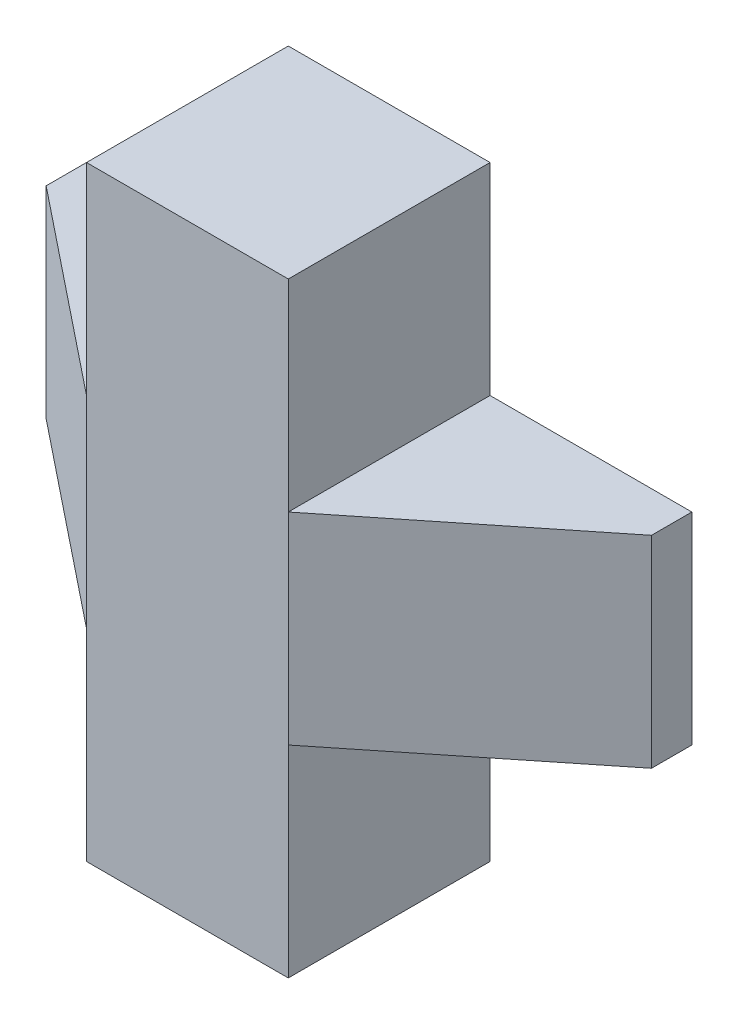
ISO-10303-21;
HEADER;
FILE_DESCRIPTION(('STEP AP214'),'2;1');
FILE_NAME('part.step','',(''),(''),'','','');
FILE_SCHEMA(('AUTOMOTIVE_DESIGN { 1 0 10303 214 1 1 1 1 }'));
ENDSEC;
DATA;
#1=APPLICATION_CONTEXT('core data for automotive mechanical design processes');
#2=APPLICATION_PROTOCOL_DEFINITION('international standard','automotive_design',2000,#1);
#3=PRODUCT_CONTEXT('',#1,'mechanical');
#4=PRODUCT('Part','Part','',(#3));
#5=PRODUCT_RELATED_PRODUCT_CATEGORY('part','',(#4));
#6=PRODUCT_DEFINITION_FORMATION('','',#4);
#7=PRODUCT_DEFINITION_CONTEXT('part definition',#1,'design');
#8=PRODUCT_DEFINITION('design','',#6,#7);
#9=PRODUCT_DEFINITION_SHAPE('','',#8);
#10=(LENGTH_UNIT() NAMED_UNIT(*) SI_UNIT(.MILLI.,.METRE.));
#11=(NAMED_UNIT(*) PLANE_ANGLE_UNIT() SI_UNIT($,.RADIAN.));
#12=(NAMED_UNIT(*) SI_UNIT($,.STERADIAN.) SOLID_ANGLE_UNIT());
#13=UNCERTAINTY_MEASURE_WITH_UNIT(LENGTH_MEASURE(1.E-05),#10,'distance_accuracy_value','');
#14=(GEOMETRIC_REPRESENTATION_CONTEXT(3) GLOBAL_UNCERTAINTY_ASSIGNED_CONTEXT((#13)) GLOBAL_UNIT_ASSIGNED_CONTEXT((#10,
#11,#12)) REPRESENTATION_CONTEXT('',''));
#15=CARTESIAN_POINT('',(0.,0.,0.));
#16=DIRECTION('',(0.,0.,1.));
#17=DIRECTION('',(1.,0.,0.));
#18=AXIS2_PLACEMENT_3D('',#15,#16,#17);
#19=CARTESIAN_POINT('',(-75.,-75.,50.));
#20=DIRECTION('',(1.,0.,0.));
#21=DIRECTION('',(0.,0.,-1.));
#22=AXIS2_PLACEMENT_3D('',#19,#20,#21);
#23=PLANE('',#22);
#24=DIRECTION('',(0.,0.,1.));
#25=VECTOR('',#24,1.);
#26=CARTESIAN_POINT('',(-75.,-25.,0.));
#27=LINE('',#26,#25);
#28=CARTESIAN_POINT('',(-75.,-25.,0.));
#29=VERTEX_POINT('',#28);
#30=CARTESIAN_POINT('',(-75.,-25.,10.));
#31=VERTEX_POINT('',#30);
#32=EDGE_CURVE('E192',#29,#31,#27,.T.);
#33=ORIENTED_EDGE('',*,*,#32,.T.);
#34=DIRECTION('',(0.,1.,0.));
#35=VECTOR('',#34,1.);
#36=CARTESIAN_POINT('',(-75.,-25.,10.));
#37=LINE('',#36,#35);
#38=CARTESIAN_POINT('',(-75.,25.,10.));
#39=VERTEX_POINT('',#38);
#40=EDGE_CURVE('E62',#31,#39,#37,.T.);
#41=ORIENTED_EDGE('',*,*,#40,.T.);
#42=DIRECTION('',(0.,0.,1.));
#43=VECTOR('',#42,1.);
#44=CARTESIAN_POINT('',(-75.,25.,0.));
#45=LINE('',#44,#43);
#46=CARTESIAN_POINT('',(-75.,25.,0.));
#47=VERTEX_POINT('',#46);
#48=EDGE_CURVE('E214',#47,#39,#45,.T.);
#49=ORIENTED_EDGE('',*,*,#48,.F.);
#50=DIRECTION('',(0.,-1.,0.));
#51=VECTOR('',#50,1.);
#52=CARTESIAN_POINT('',(-75.,-75.,0.));
#53=LINE('',#52,#51);
#54=EDGE_CURVE('E222',#47,#29,#53,.T.);
#55=ORIENTED_EDGE('',*,*,#54,.T.);
#56=EDGE_LOOP('',(#33,#41,#49,#55));
#57=FACE_BOUND('',#56,.T.);
#58=ADVANCED_FACE('F45',(#57),#23,.F.);
#59=CARTESIAN_POINT('',(75.,-75.,50.));
#60=DIRECTION('',(0.,1.,0.));
#61=DIRECTION('',(-1.,0.,0.));
#62=AXIS2_PLACEMENT_3D('',#59,#60,#61);
#63=PLANE('',#62);
#64=DIRECTION('',(1.,0.,0.));
#65=VECTOR('',#64,1.);
#66=CARTESIAN_POINT('',(75.,-75.,50.));
#67=LINE('',#66,#65);
#68=CARTESIAN_POINT('',(-25.,-75.,50.));
#69=VERTEX_POINT('',#68);
#70=CARTESIAN_POINT('',(25.,-75.,50.));
#71=VERTEX_POINT('',#70);
#72=EDGE_CURVE('E54',#69,#71,#67,.T.);
#73=ORIENTED_EDGE('',*,*,#72,.F.);
#74=DIRECTION('',(0.,0.,1.));
#75=VECTOR('',#74,1.);
#76=CARTESIAN_POINT('',(-25.,-75.,0.));
#77=LINE('',#76,#75);
#78=CARTESIAN_POINT('',(-25.,-75.,0.));
#79=VERTEX_POINT('',#78);
#80=EDGE_CURVE('E186',#79,#69,#77,.T.);
#81=ORIENTED_EDGE('',*,*,#80,.F.);
#82=DIRECTION('',(1.,0.,0.));
#83=VECTOR('',#82,1.);
#84=CARTESIAN_POINT('',(75.,-75.,0.));
#85=LINE('',#84,#83);
#86=CARTESIAN_POINT('',(25.,-75.,0.));
#87=VERTEX_POINT('',#86);
#88=EDGE_CURVE('E236',#79,#87,#85,.T.);
#89=ORIENTED_EDGE('',*,*,#88,.T.);
#90=DIRECTION('',(0.,0.,1.));
#91=VECTOR('',#90,1.);
#92=CARTESIAN_POINT('',(25.,-75.,0.));
#93=LINE('',#92,#91);
#94=EDGE_CURVE('E171',#87,#71,#93,.T.);
#95=ORIENTED_EDGE('',*,*,#94,.T.);
#96=EDGE_LOOP('',(#73,#81,#89,#95));
#97=FACE_BOUND('',#96,.T.);
#98=ADVANCED_FACE('F311',(#97),#63,.F.);
#99=CARTESIAN_POINT('',(75.,-75.,50.));
#100=DIRECTION('',(-1.,0.,0.));
#101=DIRECTION('',(0.,0.,1.));
#102=AXIS2_PLACEMENT_3D('',#99,#100,#101);
#103=PLANE('',#102);
#104=DIRECTION('',(0.,0.,1.));
#105=VECTOR('',#104,1.);
#106=CARTESIAN_POINT('',(75.,25.,0.));
#107=LINE('',#106,#105);
#108=CARTESIAN_POINT('',(75.,25.,0.));
#109=VERTEX_POINT('',#108);
#110=CARTESIAN_POINT('',(75.,25.,10.));
#111=VERTEX_POINT('',#110);
#112=EDGE_CURVE('E157',#109,#111,#107,.T.);
#113=ORIENTED_EDGE('',*,*,#112,.T.);
#114=DIRECTION('',(0.,1.,0.));
#115=VECTOR('',#114,1.);
#116=CARTESIAN_POINT('',(75.,-25.,10.));
#117=LINE('',#116,#115);
#118=CARTESIAN_POINT('',(75.,-25.,10.));
#119=VERTEX_POINT('',#118);
#120=EDGE_CURVE('E139',#119,#111,#117,.T.);
#121=ORIENTED_EDGE('',*,*,#120,.F.);
#122=DIRECTION('',(0.,0.,1.));
#123=VECTOR('',#122,1.);
#124=CARTESIAN_POINT('',(75.,-25.,0.));
#125=LINE('',#124,#123);
#126=CARTESIAN_POINT('',(75.,-25.,0.));
#127=VERTEX_POINT('',#126);
#128=EDGE_CURVE('E155',#127,#119,#125,.T.);
#129=ORIENTED_EDGE('',*,*,#128,.F.);
#130=DIRECTION('',(0.,1.,0.));
#131=VECTOR('',#130,1.);
#132=CARTESIAN_POINT('',(75.,-75.,0.));
#133=LINE('',#132,#131);
#134=EDGE_CURVE('E239',#127,#109,#133,.T.);
#135=ORIENTED_EDGE('',*,*,#134,.T.);
#136=EDGE_LOOP('',(#113,#121,#129,#135));
#137=FACE_BOUND('',#136,.T.);
#138=ADVANCED_FACE('F153',(#137),#103,.F.);
#139=CARTESIAN_POINT('',(75.,75.,50.));
#140=DIRECTION('',(0.,-1.,0.));
#141=DIRECTION('',(1.,0.,0.));
#142=AXIS2_PLACEMENT_3D('',#139,#140,#141);
#143=PLANE('',#142);
#144=DIRECTION('',(-1.,0.,0.));
#145=VECTOR('',#144,1.);
#146=CARTESIAN_POINT('',(75.,75.,50.));
#147=LINE('',#146,#145);
#148=CARTESIAN_POINT('',(25.,75.,50.));
#149=VERTEX_POINT('',#148);
#150=CARTESIAN_POINT('',(-25.,75.,50.));
#151=VERTEX_POINT('',#150);
#152=EDGE_CURVE('E11',#149,#151,#147,.T.);
#153=ORIENTED_EDGE('',*,*,#152,.F.);
#154=DIRECTION('',(0.,0.,1.));
#155=VECTOR('',#154,1.);
#156=CARTESIAN_POINT('',(25.,75.,0.));
#157=LINE('',#156,#155);
#158=CARTESIAN_POINT('',(25.,75.,0.));
#159=VERTEX_POINT('',#158);
#160=EDGE_CURVE('E248',#159,#149,#157,.T.);
#161=ORIENTED_EDGE('',*,*,#160,.F.);
#162=DIRECTION('',(-1.,0.,0.));
#163=VECTOR('',#162,1.);
#164=CARTESIAN_POINT('',(75.,75.,0.));
#165=LINE('',#164,#163);
#166=CARTESIAN_POINT('',(-25.,75.,0.));
#167=VERTEX_POINT('',#166);
#168=EDGE_CURVE('E48',#159,#167,#165,.T.);
#169=ORIENTED_EDGE('',*,*,#168,.T.);
#170=DIRECTION('',(0.,0.,1.));
#171=VECTOR('',#170,1.);
#172=CARTESIAN_POINT('',(-25.,75.,0.));
#173=LINE('',#172,#171);
#174=EDGE_CURVE('E218',#167,#151,#173,.T.);
#175=ORIENTED_EDGE('',*,*,#174,.T.);
#176=EDGE_LOOP('',(#153,#161,#169,#175));
#177=FACE_BOUND('',#176,.T.);
#178=ADVANCED_FACE('F247',(#177),#143,.F.);
#179=CARTESIAN_POINT('',(0.,0.,50.));
#180=DIRECTION('',(0.,0.,1.));
#181=DIRECTION('',(1.,0.,0.));
#182=AXIS2_PLACEMENT_3D('',#179,#180,#181);
#183=PLANE('',#182);
#184=DIRECTION('',(0.,1.,0.));
#185=VECTOR('',#184,1.);
#186=CARTESIAN_POINT('',(25.,-25.,50.));
#187=LINE('',#186,#185);
#188=CARTESIAN_POINT('',(25.,-25.,50.));
#189=VERTEX_POINT('',#188);
#190=CARTESIAN_POINT('',(25.,25.,50.));
#191=VERTEX_POINT('',#190);
#192=EDGE_CURVE('E142',#189,#191,#187,.T.);
#193=ORIENTED_EDGE('',*,*,#192,.T.);
#194=DIRECTION('',(0.,-1.,0.));
#195=VECTOR('',#194,1.);
#196=CARTESIAN_POINT('',(25.,75.,50.));
#197=LINE('',#196,#195);
#198=EDGE_CURVE('E217',#149,#191,#197,.T.);
#199=ORIENTED_EDGE('',*,*,#198,.F.);
#200=ORIENTED_EDGE('',*,*,#152,.T.);
#201=DIRECTION('',(0.,1.,0.));
#202=VECTOR('',#201,1.);
#203=CARTESIAN_POINT('',(-25.,75.,50.));
#204=LINE('',#203,#202);
#205=CARTESIAN_POINT('',(-25.,25.,50.));
#206=VERTEX_POINT('',#205);
#207=EDGE_CURVE('E210',#206,#151,#204,.T.);
#208=ORIENTED_EDGE('',*,*,#207,.F.);
#209=DIRECTION('',(0.,1.,0.));
#210=VECTOR('',#209,1.);
#211=CARTESIAN_POINT('',(-25.,-25.,50.));
#212=LINE('',#211,#210);
#213=CARTESIAN_POINT('',(-25.,-25.,50.));
#214=VERTEX_POINT('',#213);
#215=EDGE_CURVE('E271',#214,#206,#212,.T.);
#216=ORIENTED_EDGE('',*,*,#215,.F.);
#217=DIRECTION('',(0.,1.,0.));
#218=VECTOR('',#217,1.);
#219=CARTESIAN_POINT('',(-25.,-75.,50.));
#220=LINE('',#219,#218);
#221=EDGE_CURVE('E180',#69,#214,#220,.T.);
#222=ORIENTED_EDGE('',*,*,#221,.F.);
#223=ORIENTED_EDGE('',*,*,#72,.T.);
#224=DIRECTION('',(0.,-1.,0.));
#225=VECTOR('',#224,1.);
#226=CARTESIAN_POINT('',(25.,-75.,50.));
#227=LINE('',#226,#225);
#228=EDGE_CURVE('E181',#189,#71,#227,.T.);
#229=ORIENTED_EDGE('',*,*,#228,.F.);
#230=EDGE_LOOP('',(#193,#199,#200,#208,#216,#222,#223,#229));
#231=FACE_BOUND('',#230,.T.);
#232=ADVANCED_FACE('F294',(#231),#183,.T.);
#233=CARTESIAN_POINT('',(0.,0.,0.));
#234=DIRECTION('',(0.,0.,1.));
#235=DIRECTION('',(1.,0.,0.));
#236=AXIS2_PLACEMENT_3D('',#233,#234,#235);
#237=PLANE('',#236);
#238=DIRECTION('',(0.,1.,0.));
#239=VECTOR('',#238,1.);
#240=CARTESIAN_POINT('',(-25.,-75.,0.));
#241=LINE('',#240,#239);
#242=CARTESIAN_POINT('',(-25.,-25.,0.));
#243=VERTEX_POINT('',#242);
#244=EDGE_CURVE('E199',#79,#243,#241,.T.);
#245=ORIENTED_EDGE('',*,*,#244,.T.);
#246=DIRECTION('',(-1.,0.,0.));
#247=VECTOR('',#246,1.);
#248=CARTESIAN_POINT('',(-75.,-25.,0.));
#249=LINE('',#248,#247);
#250=EDGE_CURVE('E70',#243,#29,#249,.T.);
#251=ORIENTED_EDGE('',*,*,#250,.T.);
#252=ORIENTED_EDGE('',*,*,#54,.F.);
#253=DIRECTION('',(1.,0.,0.));
#254=VECTOR('',#253,1.);
#255=CARTESIAN_POINT('',(-75.,25.,0.));
#256=LINE('',#255,#254);
#257=CARTESIAN_POINT('',(-25.,25.,0.));
#258=VERTEX_POINT('',#257);
#259=EDGE_CURVE('E205',#47,#258,#256,.T.);
#260=ORIENTED_EDGE('',*,*,#259,.T.);
#261=DIRECTION('',(0.,1.,0.));
#262=VECTOR('',#261,1.);
#263=CARTESIAN_POINT('',(-25.,75.,0.));
#264=LINE('',#263,#262);
#265=EDGE_CURVE('E209',#258,#167,#264,.T.);
#266=ORIENTED_EDGE('',*,*,#265,.T.);
#267=ORIENTED_EDGE('',*,*,#168,.F.);
#268=DIRECTION('',(0.,-1.,0.));
#269=VECTOR('',#268,1.);
#270=CARTESIAN_POINT('',(25.,75.,0.));
#271=LINE('',#270,#269);
#272=CARTESIAN_POINT('',(25.,25.,0.));
#273=VERTEX_POINT('',#272);
#274=EDGE_CURVE('E174',#159,#273,#271,.T.);
#275=ORIENTED_EDGE('',*,*,#274,.T.);
#276=DIRECTION('',(1.,0.,0.));
#277=VECTOR('',#276,1.);
#278=CARTESIAN_POINT('',(75.,25.,0.));
#279=LINE('',#278,#277);
#280=EDGE_CURVE('E276',#273,#109,#279,.T.);
#281=ORIENTED_EDGE('',*,*,#280,.T.);
#282=ORIENTED_EDGE('',*,*,#134,.F.);
#283=DIRECTION('',(-1.,0.,0.));
#284=VECTOR('',#283,1.);
#285=CARTESIAN_POINT('',(75.,-25.,0.));
#286=LINE('',#285,#284);
#287=CARTESIAN_POINT('',(25.,-25.,0.));
#288=VERTEX_POINT('',#287);
#289=EDGE_CURVE('E162',#127,#288,#286,.T.);
#290=ORIENTED_EDGE('',*,*,#289,.T.);
#291=DIRECTION('',(0.,-1.,0.));
#292=VECTOR('',#291,1.);
#293=CARTESIAN_POINT('',(25.,-75.,0.));
#294=LINE('',#293,#292);
#295=EDGE_CURVE('E164',#288,#87,#294,.T.);
#296=ORIENTED_EDGE('',*,*,#295,.T.);
#297=ORIENTED_EDGE('',*,*,#88,.F.);
#298=EDGE_LOOP('',(#245,#251,#252,#260,#266,#267,#275,#281,#282,#290,#296,#297));
#299=FACE_BOUND('',#298,.T.);
#300=ADVANCED_FACE('F251',(#299),#237,.F.);
#301=CARTESIAN_POINT('',(-25.,75.,0.));
#302=DIRECTION('',(1.,0.,0.));
#303=DIRECTION('',(0.,1.,0.));
#304=AXIS2_PLACEMENT_3D('',#301,#302,#303);
#305=PLANE('',#304);
#306=ORIENTED_EDGE('',*,*,#207,.T.);
#307=ORIENTED_EDGE('',*,*,#174,.F.);
#308=ORIENTED_EDGE('',*,*,#265,.F.);
#309=DIRECTION('',(0.,0.,1.));
#310=VECTOR('',#309,1.);
#311=CARTESIAN_POINT('',(-25.,25.,0.));
#312=LINE('',#311,#310);
#313=EDGE_CURVE('E223',#258,#206,#312,.T.);
#314=ORIENTED_EDGE('',*,*,#313,.T.);
#315=EDGE_LOOP('',(#306,#307,#308,#314));
#316=FACE_BOUND('',#315,.T.);
#317=ADVANCED_FACE('F256',(#316),#305,.F.);
#318=CARTESIAN_POINT('',(-75.,25.,0.));
#319=DIRECTION('',(0.,-1.,0.));
#320=DIRECTION('',(0.,0.,-1.));
#321=AXIS2_PLACEMENT_3D('',#318,#319,#320);
#322=PLANE('',#321);
#323=ORIENTED_EDGE('',*,*,#48,.T.);
#324=DIRECTION('',(-0.78086880944303,0.,-0.624695047554424));
#325=VECTOR('',#324,1.);
#326=CARTESIAN_POINT('',(-25.,25.,50.));
#327=LINE('',#326,#325);
#328=EDGE_CURVE('E262',#206,#39,#327,.T.);
#329=ORIENTED_EDGE('',*,*,#328,.F.);
#330=ORIENTED_EDGE('',*,*,#313,.F.);
#331=ORIENTED_EDGE('',*,*,#259,.F.);
#332=EDGE_LOOP('',(#323,#329,#330,#331));
#333=FACE_BOUND('',#332,.T.);
#334=ADVANCED_FACE('F260',(#333),#322,.F.);
#335=CARTESIAN_POINT('',(75.,25.,0.));
#336=DIRECTION('',(0.,-1.,0.));
#337=DIRECTION('',(0.,0.,-1.));
#338=AXIS2_PLACEMENT_3D('',#335,#336,#337);
#339=PLANE('',#338);
#340=DIRECTION('',(0.,0.,1.));
#341=VECTOR('',#340,1.);
#342=CARTESIAN_POINT('',(25.,25.,0.));
#343=LINE('',#342,#341);
#344=EDGE_CURVE('E277',#273,#191,#343,.T.);
#345=ORIENTED_EDGE('',*,*,#344,.T.);
#346=DIRECTION('',(-0.78086880944303,0.,0.624695047554424));
#347=VECTOR('',#346,1.);
#348=CARTESIAN_POINT('',(25.,25.,50.));
#349=LINE('',#348,#347);
#350=EDGE_CURVE('E148',#111,#191,#349,.T.);
#351=ORIENTED_EDGE('',*,*,#350,.F.);
#352=ORIENTED_EDGE('',*,*,#112,.F.);
#353=ORIENTED_EDGE('',*,*,#280,.F.);
#354=EDGE_LOOP('',(#345,#351,#352,#353));
#355=FACE_BOUND('',#354,.T.);
#356=ADVANCED_FACE('F289',(#355),#339,.F.);
#357=CARTESIAN_POINT('',(25.,75.,0.));
#358=DIRECTION('',(-1.,0.,0.));
#359=DIRECTION('',(0.,-1.,0.));
#360=AXIS2_PLACEMENT_3D('',#357,#358,#359);
#361=PLANE('',#360);
#362=ORIENTED_EDGE('',*,*,#198,.T.);
#363=ORIENTED_EDGE('',*,*,#344,.F.);
#364=ORIENTED_EDGE('',*,*,#274,.F.);
#365=ORIENTED_EDGE('',*,*,#160,.T.);
#366=EDGE_LOOP('',(#362,#363,#364,#365));
#367=FACE_BOUND('',#366,.T.);
#368=ADVANCED_FACE('F291',(#367),#361,.F.);
#369=CARTESIAN_POINT('',(25.,-75.,0.));
#370=DIRECTION('',(-1.,0.,0.));
#371=DIRECTION('',(0.,0.,1.));
#372=AXIS2_PLACEMENT_3D('',#369,#370,#371);
#373=PLANE('',#372);
#374=ORIENTED_EDGE('',*,*,#228,.T.);
#375=ORIENTED_EDGE('',*,*,#94,.F.);
#376=ORIENTED_EDGE('',*,*,#295,.F.);
#377=DIRECTION('',(0.,0.,1.));
#378=VECTOR('',#377,1.);
#379=CARTESIAN_POINT('',(25.,-25.,0.));
#380=LINE('',#379,#378);
#381=EDGE_CURVE('E165',#288,#189,#380,.T.);
#382=ORIENTED_EDGE('',*,*,#381,.T.);
#383=EDGE_LOOP('',(#374,#375,#376,#382));
#384=FACE_BOUND('',#383,.T.);
#385=ADVANCED_FACE('F313',(#384),#373,.F.);
#386=CARTESIAN_POINT('',(75.,-25.,0.));
#387=DIRECTION('',(0.,1.,0.));
#388=DIRECTION('',(-1.,0.,0.));
#389=AXIS2_PLACEMENT_3D('',#386,#387,#388);
#390=PLANE('',#389);
#391=ORIENTED_EDGE('',*,*,#128,.T.);
#392=DIRECTION('',(-0.78086880944303,0.,0.624695047554424));
#393=VECTOR('',#392,1.);
#394=CARTESIAN_POINT('',(25.,-25.,50.));
#395=LINE('',#394,#393);
#396=EDGE_CURVE('E136',#119,#189,#395,.T.);
#397=ORIENTED_EDGE('',*,*,#396,.T.);
#398=ORIENTED_EDGE('',*,*,#381,.F.);
#399=ORIENTED_EDGE('',*,*,#289,.F.);
#400=EDGE_LOOP('',(#391,#397,#398,#399));
#401=FACE_BOUND('',#400,.T.);
#402=ADVANCED_FACE('F160',(#401),#390,.F.);
#403=CARTESIAN_POINT('',(-75.,-25.,0.));
#404=DIRECTION('',(0.,1.,0.));
#405=DIRECTION('',(0.,0.,1.));
#406=AXIS2_PLACEMENT_3D('',#403,#404,#405);
#407=PLANE('',#406);
#408=DIRECTION('',(0.,0.,1.));
#409=VECTOR('',#408,1.);
#410=CARTESIAN_POINT('',(-25.,-25.,0.));
#411=LINE('',#410,#409);
#412=EDGE_CURVE('E189',#243,#214,#411,.T.);
#413=ORIENTED_EDGE('',*,*,#412,.T.);
#414=DIRECTION('',(-0.78086880944303,0.,-0.624695047554424));
#415=VECTOR('',#414,1.);
#416=CARTESIAN_POINT('',(-25.,-25.,50.));
#417=LINE('',#416,#415);
#418=EDGE_CURVE('E264',#214,#31,#417,.T.);
#419=ORIENTED_EDGE('',*,*,#418,.T.);
#420=ORIENTED_EDGE('',*,*,#32,.F.);
#421=ORIENTED_EDGE('',*,*,#250,.F.);
#422=EDGE_LOOP('',(#413,#419,#420,#421));
#423=FACE_BOUND('',#422,.T.);
#424=ADVANCED_FACE('F305',(#423),#407,.F.);
#425=CARTESIAN_POINT('',(-25.,-75.,0.));
#426=DIRECTION('',(1.,0.,0.));
#427=DIRECTION('',(0.,0.,-1.));
#428=AXIS2_PLACEMENT_3D('',#425,#426,#427);
#429=PLANE('',#428);
#430=ORIENTED_EDGE('',*,*,#221,.T.);
#431=ORIENTED_EDGE('',*,*,#412,.F.);
#432=ORIENTED_EDGE('',*,*,#244,.F.);
#433=ORIENTED_EDGE('',*,*,#80,.T.);
#434=EDGE_LOOP('',(#430,#431,#432,#433));
#435=FACE_BOUND('',#434,.T.);
#436=ADVANCED_FACE('F307',(#435),#429,.F.);
#437=CARTESIAN_POINT('',(-25.,-25.,50.));
#438=DIRECTION('',(0.624695047554424,0.,-0.78086880944303));
#439=DIRECTION('',(-0.78086880944303,0.,-0.624695047554424));
#440=AXIS2_PLACEMENT_3D('',#437,#438,#439);
#441=PLANE('',#440);
#442=ORIENTED_EDGE('',*,*,#328,.T.);
#443=ORIENTED_EDGE('',*,*,#40,.F.);
#444=ORIENTED_EDGE('',*,*,#418,.F.);
#445=ORIENTED_EDGE('',*,*,#215,.T.);
#446=EDGE_LOOP('',(#442,#443,#444,#445));
#447=FACE_BOUND('',#446,.T.);
#448=ADVANCED_FACE('F302',(#447),#441,.F.);
#449=CARTESIAN_POINT('',(25.,-25.,50.));
#450=DIRECTION('',(-0.624695047554424,0.,-0.78086880944303));
#451=DIRECTION('',(-0.78086880944303,0.,0.624695047554424));
#452=AXIS2_PLACEMENT_3D('',#449,#450,#451);
#453=PLANE('',#452);
#454=ORIENTED_EDGE('',*,*,#350,.T.);
#455=ORIENTED_EDGE('',*,*,#192,.F.);
#456=ORIENTED_EDGE('',*,*,#396,.F.);
#457=ORIENTED_EDGE('',*,*,#120,.T.);
#458=EDGE_LOOP('',(#454,#455,#456,#457));
#459=FACE_BOUND('',#458,.T.);
#460=ADVANCED_FACE('F138',(#459),#453,.F.);
#461=CLOSED_SHELL('',(#58,#98,#138,#178,#232,#300,#317,#334,#356,#368,#385,#402,#424,#436,#448,#460));
#462=MANIFOLD_SOLID_BREP('B2',#461);
#463=ADVANCED_BREP_SHAPE_REPRESENTATION('',(#18,#462),#14);
#464=SHAPE_DEFINITION_REPRESENTATION(#9,#463);
ENDSEC;
END-ISO-10303-21;
